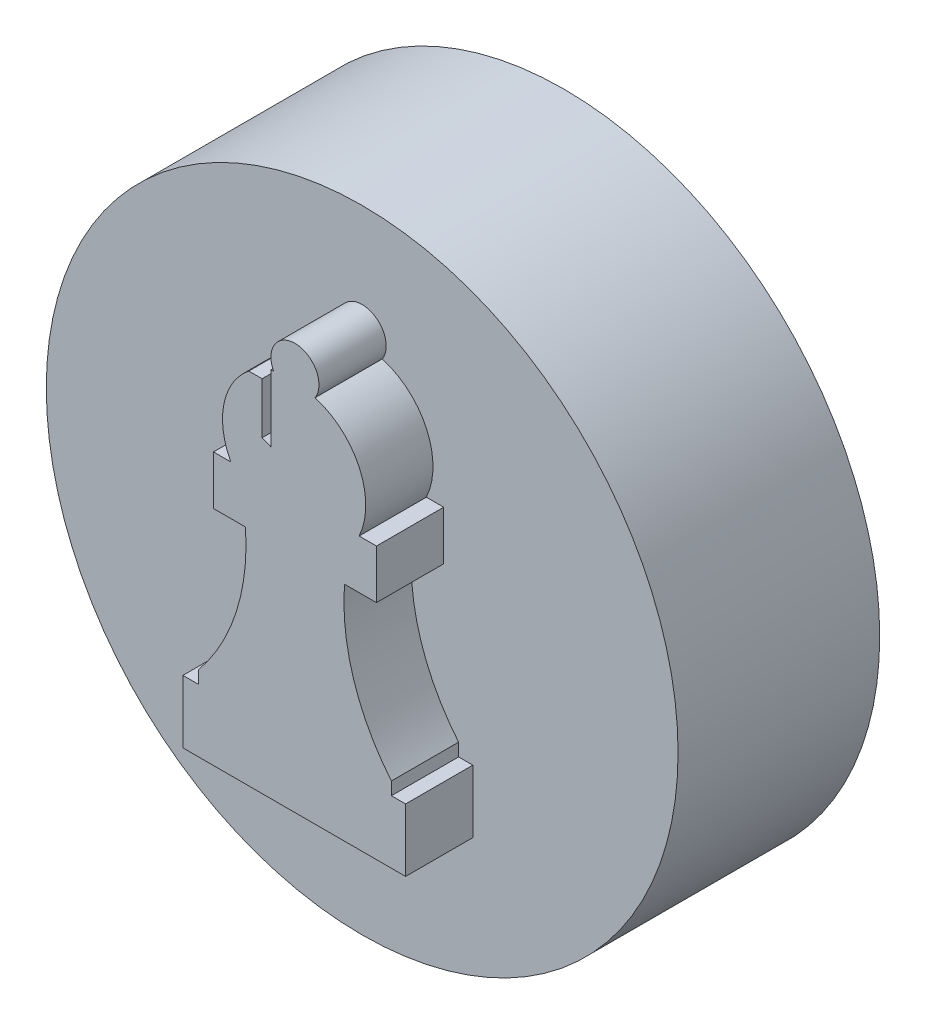
ISO-10303-21;
HEADER;
FILE_DESCRIPTION(('STEP AP214'),'2;1');
FILE_NAME('part.step','',(''),(''),'','','');
FILE_SCHEMA(('AUTOMOTIVE_DESIGN { 1 0 10303 214 1 1 1 1 }'));
ENDSEC;
DATA;
#1=APPLICATION_CONTEXT('core data for automotive mechanical design processes');
#2=APPLICATION_PROTOCOL_DEFINITION('international standard','automotive_design',2000,#1);
#3=PRODUCT_CONTEXT('',#1,'mechanical');
#4=PRODUCT('Part','Part','',(#3));
#5=PRODUCT_RELATED_PRODUCT_CATEGORY('part','',(#4));
#6=PRODUCT_DEFINITION_FORMATION('','',#4);
#7=PRODUCT_DEFINITION_CONTEXT('part definition',#1,'design');
#8=PRODUCT_DEFINITION('design','',#6,#7);
#9=PRODUCT_DEFINITION_SHAPE('','',#8);
#10=(LENGTH_UNIT() NAMED_UNIT(*) SI_UNIT(.MILLI.,.METRE.));
#11=(NAMED_UNIT(*) PLANE_ANGLE_UNIT() SI_UNIT($,.RADIAN.));
#12=(NAMED_UNIT(*) SI_UNIT($,.STERADIAN.) SOLID_ANGLE_UNIT());
#13=UNCERTAINTY_MEASURE_WITH_UNIT(LENGTH_MEASURE(1.E-05),#10,'distance_accuracy_value','');
#14=(GEOMETRIC_REPRESENTATION_CONTEXT(3) GLOBAL_UNCERTAINTY_ASSIGNED_CONTEXT((#13)) GLOBAL_UNIT_ASSIGNED_CONTEXT((#10,
#11,#12)) REPRESENTATION_CONTEXT('',''));
#15=CARTESIAN_POINT('',(0.,0.,0.));
#16=DIRECTION('',(0.,0.,1.));
#17=DIRECTION('',(1.,0.,0.));
#18=AXIS2_PLACEMENT_3D('',#15,#16,#17);
#19=CARTESIAN_POINT('',(0.,0.,0.));
#20=DIRECTION('',(0.,0.,1.));
#21=DIRECTION('',(1.,0.,0.));
#22=AXIS2_PLACEMENT_3D('',#19,#20,#21);
#23=PLANE('',#22);
#24=CARTESIAN_POINT('',(0.,0.,0.));
#25=DIRECTION('',(0.,0.,1.));
#26=DIRECTION('',(1.,0.,0.));
#27=AXIS2_PLACEMENT_3D('',#24,#25,#26);
#28=CIRCLE('',#27,11.938);
#29=CARTESIAN_POINT('',(11.938,0.,0.));
#30=VERTEX_POINT('',#29);
#31=EDGE_CURVE('E11',#30,#30,#28,.T.);
#32=ORIENTED_EDGE('',*,*,#31,.F.);
#33=EDGE_LOOP('',(#32));
#34=FACE_BOUND('',#33,.T.);
#35=CARTESIAN_POINT('',(0.,0.,0.));
#36=DIRECTION('',(0.,0.,1.));
#37=DIRECTION('',(1.,0.,0.));
#38=AXIS2_PLACEMENT_3D('',#35,#36,#37);
#39=CIRCLE('',#38,8.763);
#40=CARTESIAN_POINT('',(8.763,0.,0.));
#41=VERTEX_POINT('',#40);
#42=EDGE_CURVE('E48',#41,#41,#39,.T.);
#43=ORIENTED_EDGE('',*,*,#42,.T.);
#44=EDGE_LOOP('',(#43));
#45=FACE_BOUND('',#44,.T.);
#46=ADVANCED_FACE('F39',(#34,#45),#23,.F.);
#47=CARTESIAN_POINT('',(0.,0.,5.08));
#48=DIRECTION('',(0.,0.,-1.));
#49=DIRECTION('',(-1.,0.,0.));
#50=AXIS2_PLACEMENT_3D('',#47,#48,#49);
#51=CYLINDRICAL_SURFACE('',#50,11.938);
#52=ORIENTED_EDGE('',*,*,#31,.T.);
#53=EDGE_LOOP('',(#52));
#54=FACE_BOUND('',#53,.T.);
#55=CARTESIAN_POINT('',(0.,0.,7.62));
#56=DIRECTION('',(0.,0.,1.));
#57=DIRECTION('',(1.,0.,0.));
#58=AXIS2_PLACEMENT_3D('',#55,#56,#57);
#59=CIRCLE('',#58,11.938);
#60=CARTESIAN_POINT('',(11.938,0.,7.62));
#61=VERTEX_POINT('',#60);
#62=EDGE_CURVE('E219',#61,#61,#59,.T.);
#63=ORIENTED_EDGE('',*,*,#62,.F.);
#64=EDGE_LOOP('',(#63));
#65=FACE_BOUND('',#64,.T.);
#66=ADVANCED_FACE('F41',(#54,#65),#51,.T.);
#67=CARTESIAN_POINT('',(0.,0.,5.08));
#68=DIRECTION('',(0.,0.,-1.));
#69=DIRECTION('',(-1.,0.,0.));
#70=AXIS2_PLACEMENT_3D('',#67,#68,#69);
#71=CYLINDRICAL_SURFACE('',#70,8.763);
#72=CARTESIAN_POINT('',(0.,0.,5.08));
#73=DIRECTION('',(0.,0.,1.));
#74=DIRECTION('',(1.,0.,0.));
#75=AXIS2_PLACEMENT_3D('',#72,#73,#74);
#76=CIRCLE('',#75,8.763);
#77=CARTESIAN_POINT('',(8.763,0.,5.08));
#78=VERTEX_POINT('',#77);
#79=EDGE_CURVE('E224',#78,#78,#76,.T.);
#80=ORIENTED_EDGE('',*,*,#79,.T.);
#81=EDGE_LOOP('',(#80));
#82=FACE_BOUND('',#81,.T.);
#83=ORIENTED_EDGE('',*,*,#42,.F.);
#84=EDGE_LOOP('',(#83));
#85=FACE_BOUND('',#84,.T.);
#86=ADVANCED_FACE('F237',(#82,#85),#71,.F.);
#87=CARTESIAN_POINT('',(0.,0.,5.08));
#88=DIRECTION('',(0.,0.,1.));
#89=DIRECTION('',(1.,0.,0.));
#90=AXIS2_PLACEMENT_3D('',#87,#88,#89);
#91=PLANE('',#90);
#92=ORIENTED_EDGE('',*,*,#79,.F.);
#93=EDGE_LOOP('',(#92));
#94=FACE_BOUND('',#93,.T.);
#95=ADVANCED_FACE('F239',(#94),#91,.F.);
#96=CARTESIAN_POINT('',(0.,0.,7.62));
#97=DIRECTION('',(0.,0.,1.));
#98=DIRECTION('',(1.,0.,0.));
#99=AXIS2_PLACEMENT_3D('',#96,#97,#98);
#100=PLANE('',#99);
#101=CARTESIAN_POINT('',(-0.0936496548773762,4.84947966373049,7.62));
#102=DIRECTION('',(0.,0.,1.));
#103=DIRECTION('',(1.,0.,0.));
#104=AXIS2_PLACEMENT_3D('',#101,#102,#103);
#105=CIRCLE('',#104,2.64442949598873);
#106=CARTESIAN_POINT('',(-1.74431169762998,6.9154714787847,7.62));
#107=VERTEX_POINT('',#106);
#108=CARTESIAN_POINT('',(-2.42520893945643,3.60174625400373,7.62));
#109=VERTEX_POINT('',#108);
#110=EDGE_CURVE('E55',#107,#109,#105,.T.);
#111=ORIENTED_EDGE('',*,*,#110,.F.);
#112=DIRECTION('',(1.,0.,0.));
#113=VECTOR('',#112,1.);
#114=CARTESIAN_POINT('',(-1.74431169762998,6.9154714787847,7.62));
#115=LINE('',#114,#113);
#116=CARTESIAN_POINT('',(-1.24222402192209,6.9154714787847,7.62));
#117=VERTEX_POINT('',#116);
#118=EDGE_CURVE('E60',#107,#117,#115,.T.);
#119=ORIENTED_EDGE('',*,*,#118,.T.);
#120=DIRECTION('',(0.,-1.,0.));
#121=VECTOR('',#120,1.);
#122=CARTESIAN_POINT('',(-1.24222402192209,6.9154714787847,7.62));
#123=LINE('',#122,#121);
#124=CARTESIAN_POINT('',(-1.24222402192209,4.98580544243909,7.62));
#125=VERTEX_POINT('',#124);
#126=EDGE_CURVE('E527',#117,#125,#123,.T.);
#127=ORIENTED_EDGE('',*,*,#126,.T.);
#128=DIRECTION('',(0.926439935150013,-0.376442620540289,0.));
#129=VECTOR('',#128,1.);
#130=CARTESIAN_POINT('',(-1.24222402192209,4.98580544243909,7.62));
#131=LINE('',#130,#129);
#132=CARTESIAN_POINT('',(-0.906720976584663,4.84947966373049,7.62));
#133=VERTEX_POINT('',#132);
#134=EDGE_CURVE('E530',#125,#133,#131,.T.);
#135=ORIENTED_EDGE('',*,*,#134,.T.);
#136=DIRECTION('',(0.,1.,0.));
#137=VECTOR('',#136,1.);
#138=CARTESIAN_POINT('',(-0.906720976584663,4.84947966373049,7.62));
#139=LINE('',#138,#137);
#140=CARTESIAN_POINT('',(-0.906720976584663,7.37263085876686,7.62));
#141=VERTEX_POINT('',#140);
#142=EDGE_CURVE('E679',#133,#141,#139,.T.);
#143=ORIENTED_EDGE('',*,*,#142,.T.);
#144=DIRECTION('',(1.,0.,0.));
#145=VECTOR('',#144,1.);
#146=CARTESIAN_POINT('',(-0.906720976584663,7.37263085876686,7.62));
#147=LINE('',#146,#145);
#148=CARTESIAN_POINT('',(-0.805595187549615,7.37263085876686,7.62));
#149=VERTEX_POINT('',#148);
#150=EDGE_CURVE('E676',#141,#149,#147,.T.);
#151=ORIENTED_EDGE('',*,*,#150,.T.);
#152=CARTESIAN_POINT('',(0.,7.78875502674505,7.62));
#153=DIRECTION('',(0.,0.,1.));
#154=DIRECTION('',(1.,0.,0.));
#155=AXIS2_PLACEMENT_3D('',#152,#153,#154);
#156=CIRCLE('',#155,0.906720976584663);
#157=CARTESIAN_POINT('',(0.760232512341825,7.29459973075291,7.62));
#158=VERTEX_POINT('',#157);
#159=EDGE_CURVE('E672',#158,#149,#156,.T.);
#160=ORIENTED_EDGE('',*,*,#159,.F.);
#161=CARTESIAN_POINT('',(0.00107302512031239,4.73055559467947,7.62));
#162=DIRECTION('',(0.,0.,-1.));
#163=DIRECTION('',(-1.,0.,0.));
#164=AXIS2_PLACEMENT_3D('',#161,#162,#163);
#165=CIRCLE('',#164,2.67406908264746);
#166=CARTESIAN_POINT('',(2.42520893945643,3.60174625400373,7.62));
#167=VERTEX_POINT('',#166);
#168=EDGE_CURVE('E669',#158,#167,#165,.T.);
#169=ORIENTED_EDGE('',*,*,#168,.T.);
#170=DIRECTION('',(1.,0.,0.));
#171=VECTOR('',#170,1.);
#172=CARTESIAN_POINT('',(2.42520893945643,3.60174625400373,7.62));
#173=LINE('',#172,#171);
#174=CARTESIAN_POINT('',(3.07963487745926,3.60174625400373,7.62));
#175=VERTEX_POINT('',#174);
#176=EDGE_CURVE('E666',#167,#175,#173,.T.);
#177=ORIENTED_EDGE('',*,*,#176,.T.);
#178=DIRECTION('',(0.,-1.,0.));
#179=VECTOR('',#178,1.);
#180=CARTESIAN_POINT('',(3.07963487745926,3.60174625400373,7.62));
#181=LINE('',#180,#179);
#182=CARTESIAN_POINT('',(3.07963487745926,1.74914689622965,7.62));
#183=VERTEX_POINT('',#182);
#184=EDGE_CURVE('E663',#175,#183,#181,.T.);
#185=ORIENTED_EDGE('',*,*,#184,.T.);
#186=DIRECTION('',(-1.,0.,0.));
#187=VECTOR('',#186,1.);
#188=CARTESIAN_POINT('',(3.07963487745926,1.74914689622965,7.62));
#189=LINE('',#188,#187);
#190=CARTESIAN_POINT('',(1.87141053803479,1.74914689622965,7.62));
#191=VERTEX_POINT('',#190);
#192=EDGE_CURVE('E660',#183,#191,#189,.T.);
#193=ORIENTED_EDGE('',*,*,#192,.T.);
#194=CARTESIAN_POINT('',(9.63017955509423,1.16502725049051,7.62));
#195=DIRECTION('',(0.,0.,-1.));
#196=DIRECTION('',(-1.,0.,0.));
#197=AXIS2_PLACEMENT_3D('',#194,#195,#196);
#198=CIRCLE('',#197,7.7807257001272);
#199=CARTESIAN_POINT('',(3.64389495603139,-3.8052935761406,7.62));
#200=VERTEX_POINT('',#199);
#201=EDGE_CURVE('E656',#200,#191,#198,.T.);
#202=ORIENTED_EDGE('',*,*,#201,.F.);
#203=DIRECTION('',(0.,1.,0.));
#204=VECTOR('',#203,1.);
#205=CARTESIAN_POINT('',(3.64389495603139,-4.28867332886855,7.62));
#206=LINE('',#205,#204);
#207=CARTESIAN_POINT('',(3.64389495603139,-4.28867332886855,7.62));
#208=VERTEX_POINT('',#207);
#209=EDGE_CURVE('E652',#208,#200,#206,.T.);
#210=ORIENTED_EDGE('',*,*,#209,.F.);
#211=DIRECTION('',(-1.,0.,0.));
#212=VECTOR('',#211,1.);
#213=CARTESIAN_POINT('',(4.18073345920061,-4.28867332886855,7.62));
#214=LINE('',#213,#212);
#215=CARTESIAN_POINT('',(4.18073345920061,-4.28867332886855,7.62));
#216=VERTEX_POINT('',#215);
#217=EDGE_CURVE('E648',#216,#208,#214,.T.);
#218=ORIENTED_EDGE('',*,*,#217,.F.);
#219=DIRECTION('',(0.,-1.,0.));
#220=VECTOR('',#219,1.);
#221=CARTESIAN_POINT('',(4.18073345920061,-4.28867332886855,7.62));
#222=LINE('',#221,#220);
#223=CARTESIAN_POINT('',(4.18073345920061,-6.66173626167252,7.62));
#224=VERTEX_POINT('',#223);
#225=EDGE_CURVE('E645',#216,#224,#222,.T.);
#226=ORIENTED_EDGE('',*,*,#225,.T.);
#227=DIRECTION('',(-1.,0.,0.));
#228=VECTOR('',#227,1.);
#229=CARTESIAN_POINT('',(4.18073345920061,-6.66173626167252,7.62));
#230=LINE('',#229,#228);
#231=CARTESIAN_POINT('',(-4.23507735404233,-6.66173626167252,7.62));
#232=VERTEX_POINT('',#231);
#233=EDGE_CURVE('E642',#224,#232,#230,.T.);
#234=ORIENTED_EDGE('',*,*,#233,.T.);
#235=DIRECTION('',(0.,-1.,0.));
#236=VECTOR('',#235,1.);
#237=CARTESIAN_POINT('',(-4.23507735404233,-4.28867332886855,7.62));
#238=LINE('',#237,#236);
#239=CARTESIAN_POINT('',(-4.23507735404233,-4.28867332886855,7.62));
#240=VERTEX_POINT('',#239);
#241=EDGE_CURVE('E638',#240,#232,#238,.T.);
#242=ORIENTED_EDGE('',*,*,#241,.F.);
#243=DIRECTION('',(-1.,0.,0.));
#244=VECTOR('',#243,1.);
#245=CARTESIAN_POINT('',(-3.64389495603139,-4.28867332886855,7.62));
#246=LINE('',#245,#244);
#247=CARTESIAN_POINT('',(-3.64389495603139,-4.28867332886855,7.62));
#248=VERTEX_POINT('',#247);
#249=EDGE_CURVE('E634',#248,#240,#246,.T.);
#250=ORIENTED_EDGE('',*,*,#249,.F.);
#251=DIRECTION('',(0.,1.,0.));
#252=VECTOR('',#251,1.);
#253=CARTESIAN_POINT('',(-3.64389495603139,-4.28867332886855,7.62));
#254=LINE('',#253,#252);
#255=CARTESIAN_POINT('',(-3.64389495603139,-3.8052935761406,7.62));
#256=VERTEX_POINT('',#255);
#257=EDGE_CURVE('E631',#248,#256,#254,.T.);
#258=ORIENTED_EDGE('',*,*,#257,.T.);
#259=CARTESIAN_POINT('',(-9.63017955509423,1.16502725049051,7.62));
#260=DIRECTION('',(0.,0.,1.));
#261=DIRECTION('',(1.,0.,0.));
#262=AXIS2_PLACEMENT_3D('',#259,#260,#261);
#263=CIRCLE('',#262,7.7807257001272);
#264=CARTESIAN_POINT('',(-1.87141053803479,1.74914689622964,7.62));
#265=VERTEX_POINT('',#264);
#266=EDGE_CURVE('E624',#256,#265,#263,.T.);
#267=ORIENTED_EDGE('',*,*,#266,.T.);
#268=DIRECTION('',(1.,0.,0.));
#269=VECTOR('',#268,1.);
#270=CARTESIAN_POINT('',(-3.07963487745926,1.74914689622965,7.62));
#271=LINE('',#270,#269);
#272=CARTESIAN_POINT('',(-3.07963487745926,1.74914689622965,7.62));
#273=VERTEX_POINT('',#272);
#274=EDGE_CURVE('E615',#273,#265,#271,.T.);
#275=ORIENTED_EDGE('',*,*,#274,.F.);
#276=DIRECTION('',(0.,-1.,0.));
#277=VECTOR('',#276,1.);
#278=CARTESIAN_POINT('',(-3.07963487745926,3.60174625400373,7.62));
#279=LINE('',#278,#277);
#280=CARTESIAN_POINT('',(-3.07963487745926,3.60174625400373,7.62));
#281=VERTEX_POINT('',#280);
#282=EDGE_CURVE('E618',#281,#273,#279,.T.);
#283=ORIENTED_EDGE('',*,*,#282,.F.);
#284=DIRECTION('',(-1.,0.,0.));
#285=VECTOR('',#284,1.);
#286=CARTESIAN_POINT('',(-2.42520893945643,3.60174625400373,7.62));
#287=LINE('',#286,#285);
#288=EDGE_CURVE('E620',#109,#281,#287,.T.);
#289=ORIENTED_EDGE('',*,*,#288,.F.);
#290=EDGE_LOOP('',(#111,#119,#127,#135,#143,#151,#160,#169,#177,#185,#193,#202,#210,#218,#226,
#234,#242,#250,#258,#267,#275,#283,#289));
#291=FACE_BOUND('',#290,.T.);
#292=ORIENTED_EDGE('',*,*,#62,.T.);
#293=EDGE_LOOP('',(#292));
#294=FACE_BOUND('',#293,.T.);
#295=ADVANCED_FACE('F246',(#291,#294),#100,.T.);
#296=CARTESIAN_POINT('',(-0.0936496548773762,4.84947966373049,10.16));
#297=DIRECTION('',(0.,0.,-1.));
#298=DIRECTION('',(-1.,0.,0.));
#299=AXIS2_PLACEMENT_3D('',#296,#297,#298);
#300=CYLINDRICAL_SURFACE('',#299,2.64442949598873);
#301=ORIENTED_EDGE('',*,*,#110,.T.);
#302=DIRECTION('',(0.,0.,-1.));
#303=VECTOR('',#302,1.);
#304=CARTESIAN_POINT('',(-2.42520893945643,3.60174625400373,10.16));
#305=LINE('',#304,#303);
#306=CARTESIAN_POINT('',(-2.42520893945643,3.60174625400373,10.16));
#307=VERTEX_POINT('',#306);
#308=EDGE_CURVE('E199',#307,#109,#305,.T.);
#309=ORIENTED_EDGE('',*,*,#308,.F.);
#310=CARTESIAN_POINT('',(-0.0936496548773762,4.84947966373049,10.16));
#311=DIRECTION('',(0.,0.,1.));
#312=DIRECTION('',(1.,0.,0.));
#313=AXIS2_PLACEMENT_3D('',#310,#311,#312);
#314=CIRCLE('',#313,2.64442949598873);
#315=CARTESIAN_POINT('',(-1.74431169762998,6.9154714787847,10.16));
#316=VERTEX_POINT('',#315);
#317=EDGE_CURVE('E206',#316,#307,#314,.T.);
#318=ORIENTED_EDGE('',*,*,#317,.F.);
#319=DIRECTION('',(0.,0.,-1.));
#320=VECTOR('',#319,1.);
#321=CARTESIAN_POINT('',(-1.74431169762998,6.9154714787847,10.16));
#322=LINE('',#321,#320);
#323=EDGE_CURVE('E523',#316,#107,#322,.T.);
#324=ORIENTED_EDGE('',*,*,#323,.T.);
#325=EDGE_LOOP('',(#301,#309,#318,#324));
#326=FACE_BOUND('',#325,.T.);
#327=ADVANCED_FACE('F217',(#326),#300,.T.);
#328=CARTESIAN_POINT('',(-2.42520893945643,3.60174625400373,10.16));
#329=DIRECTION('',(0.,-1.,0.));
#330=DIRECTION('',(0.,0.,-1.));
#331=AXIS2_PLACEMENT_3D('',#328,#329,#330);
#332=PLANE('',#331);
#333=ORIENTED_EDGE('',*,*,#288,.T.);
#334=DIRECTION('',(0.,0.,-1.));
#335=VECTOR('',#334,1.);
#336=CARTESIAN_POINT('',(-3.07963487745926,3.60174625400373,10.16));
#337=LINE('',#336,#335);
#338=CARTESIAN_POINT('',(-3.07963487745926,3.60174625400373,10.16));
#339=VERTEX_POINT('',#338);
#340=EDGE_CURVE('E201',#339,#281,#337,.T.);
#341=ORIENTED_EDGE('',*,*,#340,.F.);
#342=DIRECTION('',(-1.,0.,0.));
#343=VECTOR('',#342,1.);
#344=CARTESIAN_POINT('',(-2.42520893945643,3.60174625400373,10.16));
#345=LINE('',#344,#343);
#346=EDGE_CURVE('E194',#307,#339,#345,.T.);
#347=ORIENTED_EDGE('',*,*,#346,.F.);
#348=ORIENTED_EDGE('',*,*,#308,.T.);
#349=EDGE_LOOP('',(#333,#341,#347,#348));
#350=FACE_BOUND('',#349,.T.);
#351=ADVANCED_FACE('F197',(#350),#332,.F.);
#352=CARTESIAN_POINT('',(-3.07963487745926,3.60174625400373,10.16));
#353=DIRECTION('',(1.,0.,0.));
#354=DIRECTION('',(0.,0.,-1.));
#355=AXIS2_PLACEMENT_3D('',#352,#353,#354);
#356=PLANE('',#355);
#357=ORIENTED_EDGE('',*,*,#282,.T.);
#358=DIRECTION('',(0.,0.,-1.));
#359=VECTOR('',#358,1.);
#360=CARTESIAN_POINT('',(-3.07963487745926,1.74914689622965,10.16));
#361=LINE('',#360,#359);
#362=CARTESIAN_POINT('',(-3.07963487745926,1.74914689622965,10.16));
#363=VERTEX_POINT('',#362);
#364=EDGE_CURVE('E226',#363,#273,#361,.T.);
#365=ORIENTED_EDGE('',*,*,#364,.F.);
#366=DIRECTION('',(0.,-1.,0.));
#367=VECTOR('',#366,1.);
#368=CARTESIAN_POINT('',(-3.07963487745926,3.60174625400373,10.16));
#369=LINE('',#368,#367);
#370=EDGE_CURVE('E205',#339,#363,#369,.T.);
#371=ORIENTED_EDGE('',*,*,#370,.F.);
#372=ORIENTED_EDGE('',*,*,#340,.T.);
#373=EDGE_LOOP('',(#357,#365,#371,#372));
#374=FACE_BOUND('',#373,.T.);
#375=ADVANCED_FACE('F267',(#374),#356,.F.);
#376=CARTESIAN_POINT('',(-3.07963487745926,1.74914689622965,10.16));
#377=DIRECTION('',(0.,1.,0.));
#378=DIRECTION('',(0.,0.,1.));
#379=AXIS2_PLACEMENT_3D('',#376,#377,#378);
#380=PLANE('',#379);
#381=ORIENTED_EDGE('',*,*,#274,.T.);
#382=DIRECTION('',(0.,0.,-1.));
#383=VECTOR('',#382,1.);
#384=CARTESIAN_POINT('',(-1.87141053803479,1.74914689622964,10.16));
#385=LINE('',#384,#383);
#386=CARTESIAN_POINT('',(-1.87141053803479,1.74914689622964,10.16));
#387=VERTEX_POINT('',#386);
#388=EDGE_CURVE('E606',#387,#265,#385,.T.);
#389=ORIENTED_EDGE('',*,*,#388,.F.);
#390=DIRECTION('',(1.,0.,0.));
#391=VECTOR('',#390,1.);
#392=CARTESIAN_POINT('',(-3.07963487745926,1.74914689622965,10.16));
#393=LINE('',#392,#391);
#394=EDGE_CURVE('E616',#363,#387,#393,.T.);
#395=ORIENTED_EDGE('',*,*,#394,.F.);
#396=ORIENTED_EDGE('',*,*,#364,.T.);
#397=EDGE_LOOP('',(#381,#389,#395,#396));
#398=FACE_BOUND('',#397,.T.);
#399=ADVANCED_FACE('F270',(#398),#380,.F.);
#400=CARTESIAN_POINT('',(-9.63017955509423,1.16502725049051,10.16));
#401=DIRECTION('',(0.,0.,-1.));
#402=DIRECTION('',(-1.,0.,0.));
#403=AXIS2_PLACEMENT_3D('',#400,#401,#402);
#404=CYLINDRICAL_SURFACE('',#403,7.7807257001272);
#405=ORIENTED_EDGE('',*,*,#266,.F.);
#406=DIRECTION('',(0.,0.,-1.));
#407=VECTOR('',#406,1.);
#408=CARTESIAN_POINT('',(-3.64389495603139,-3.8052935761406,10.16));
#409=LINE('',#408,#407);
#410=CARTESIAN_POINT('',(-3.64389495603139,-3.8052935761406,10.16));
#411=VERTEX_POINT('',#410);
#412=EDGE_CURVE('E602',#411,#256,#409,.T.);
#413=ORIENTED_EDGE('',*,*,#412,.F.);
#414=CARTESIAN_POINT('',(-9.63017955509423,1.16502725049051,10.16));
#415=DIRECTION('',(0.,0.,1.));
#416=DIRECTION('',(1.,0.,0.));
#417=AXIS2_PLACEMENT_3D('',#414,#415,#416);
#418=CIRCLE('',#417,7.7807257001272);
#419=EDGE_CURVE('E738',#411,#387,#418,.T.);
#420=ORIENTED_EDGE('',*,*,#419,.T.);
#421=ORIENTED_EDGE('',*,*,#388,.T.);
#422=EDGE_LOOP('',(#405,#413,#420,#421));
#423=FACE_BOUND('',#422,.T.);
#424=ADVANCED_FACE('F274',(#423),#404,.F.);
#425=CARTESIAN_POINT('',(-3.64389495603139,-4.28867332886855,10.16));
#426=DIRECTION('',(-1.,0.,0.));
#427=DIRECTION('',(0.,0.,1.));
#428=AXIS2_PLACEMENT_3D('',#425,#426,#427);
#429=PLANE('',#428);
#430=ORIENTED_EDGE('',*,*,#257,.F.);
#431=DIRECTION('',(0.,0.,-1.));
#432=VECTOR('',#431,1.);
#433=CARTESIAN_POINT('',(-3.64389495603139,-4.28867332886855,10.16));
#434=LINE('',#433,#432);
#435=CARTESIAN_POINT('',(-3.64389495603139,-4.28867332886855,10.16));
#436=VERTEX_POINT('',#435);
#437=EDGE_CURVE('E598',#436,#248,#434,.T.);
#438=ORIENTED_EDGE('',*,*,#437,.F.);
#439=DIRECTION('',(0.,1.,0.));
#440=VECTOR('',#439,1.);
#441=CARTESIAN_POINT('',(-3.64389495603139,-4.28867332886855,10.16));
#442=LINE('',#441,#440);
#443=EDGE_CURVE('E740',#436,#411,#442,.T.);
#444=ORIENTED_EDGE('',*,*,#443,.T.);
#445=ORIENTED_EDGE('',*,*,#412,.T.);
#446=EDGE_LOOP('',(#430,#438,#444,#445));
#447=FACE_BOUND('',#446,.T.);
#448=ADVANCED_FACE('F278',(#447),#429,.T.);
#449=CARTESIAN_POINT('',(-3.64389495603139,-4.28867332886855,10.16));
#450=DIRECTION('',(0.,-1.,0.));
#451=DIRECTION('',(0.,0.,-1.));
#452=AXIS2_PLACEMENT_3D('',#449,#450,#451);
#453=PLANE('',#452);
#454=ORIENTED_EDGE('',*,*,#249,.T.);
#455=DIRECTION('',(0.,0.,-1.));
#456=VECTOR('',#455,1.);
#457=CARTESIAN_POINT('',(-4.23507735404233,-4.28867332886855,10.16));
#458=LINE('',#457,#456);
#459=CARTESIAN_POINT('',(-4.23507735404233,-4.28867332886855,10.16));
#460=VERTEX_POINT('',#459);
#461=EDGE_CURVE('E594',#460,#240,#458,.T.);
#462=ORIENTED_EDGE('',*,*,#461,.F.);
#463=DIRECTION('',(-1.,0.,0.));
#464=VECTOR('',#463,1.);
#465=CARTESIAN_POINT('',(-3.64389495603139,-4.28867332886855,10.16));
#466=LINE('',#465,#464);
#467=EDGE_CURVE('E732',#436,#460,#466,.T.);
#468=ORIENTED_EDGE('',*,*,#467,.F.);
#469=ORIENTED_EDGE('',*,*,#437,.T.);
#470=EDGE_LOOP('',(#454,#462,#468,#469));
#471=FACE_BOUND('',#470,.T.);
#472=ADVANCED_FACE('F282',(#471),#453,.F.);
#473=CARTESIAN_POINT('',(-4.23507735404233,-4.28867332886855,10.16));
#474=DIRECTION('',(1.,0.,0.));
#475=DIRECTION('',(0.,0.,-1.));
#476=AXIS2_PLACEMENT_3D('',#473,#474,#475);
#477=PLANE('',#476);
#478=ORIENTED_EDGE('',*,*,#241,.T.);
#479=DIRECTION('',(0.,0.,-1.));
#480=VECTOR('',#479,1.);
#481=CARTESIAN_POINT('',(-4.23507735404233,-6.66173626167252,10.16));
#482=LINE('',#481,#480);
#483=CARTESIAN_POINT('',(-4.23507735404233,-6.66173626167252,10.16));
#484=VERTEX_POINT('',#483);
#485=EDGE_CURVE('E590',#484,#232,#482,.T.);
#486=ORIENTED_EDGE('',*,*,#485,.F.);
#487=DIRECTION('',(0.,-1.,0.));
#488=VECTOR('',#487,1.);
#489=CARTESIAN_POINT('',(-4.23507735404233,-4.28867332886855,10.16));
#490=LINE('',#489,#488);
#491=EDGE_CURVE('E750',#460,#484,#490,.T.);
#492=ORIENTED_EDGE('',*,*,#491,.F.);
#493=ORIENTED_EDGE('',*,*,#461,.T.);
#494=EDGE_LOOP('',(#478,#486,#492,#493));
#495=FACE_BOUND('',#494,.T.);
#496=ADVANCED_FACE('F286',(#495),#477,.F.);
#497=CARTESIAN_POINT('',(4.18073345920061,-6.66173626167252,10.16));
#498=DIRECTION('',(0.,-1.,0.));
#499=DIRECTION('',(0.,0.,-1.));
#500=AXIS2_PLACEMENT_3D('',#497,#498,#499);
#501=PLANE('',#500);
#502=ORIENTED_EDGE('',*,*,#233,.F.);
#503=DIRECTION('',(0.,0.,-1.));
#504=VECTOR('',#503,1.);
#505=CARTESIAN_POINT('',(4.18073345920061,-6.66173626167252,10.16));
#506=LINE('',#505,#504);
#507=CARTESIAN_POINT('',(4.18073345920061,-6.66173626167252,10.16));
#508=VERTEX_POINT('',#507);
#509=EDGE_CURVE('E586',#508,#224,#506,.T.);
#510=ORIENTED_EDGE('',*,*,#509,.F.);
#511=DIRECTION('',(-1.,0.,0.));
#512=VECTOR('',#511,1.);
#513=CARTESIAN_POINT('',(4.18073345920061,-6.66173626167252,10.16));
#514=LINE('',#513,#512);
#515=EDGE_CURVE('E727',#508,#484,#514,.T.);
#516=ORIENTED_EDGE('',*,*,#515,.T.);
#517=ORIENTED_EDGE('',*,*,#485,.T.);
#518=EDGE_LOOP('',(#502,#510,#516,#517));
#519=FACE_BOUND('',#518,.T.);
#520=ADVANCED_FACE('F290',(#519),#501,.T.);
#521=CARTESIAN_POINT('',(4.18073345920061,-4.28867332886855,10.16));
#522=DIRECTION('',(1.,0.,0.));
#523=DIRECTION('',(0.,0.,-1.));
#524=AXIS2_PLACEMENT_3D('',#521,#522,#523);
#525=PLANE('',#524);
#526=ORIENTED_EDGE('',*,*,#225,.F.);
#527=DIRECTION('',(0.,0.,-1.));
#528=VECTOR('',#527,1.);
#529=CARTESIAN_POINT('',(4.18073345920061,-4.28867332886855,10.16));
#530=LINE('',#529,#528);
#531=CARTESIAN_POINT('',(4.18073345920061,-4.28867332886855,10.16));
#532=VERTEX_POINT('',#531);
#533=EDGE_CURVE('E582',#532,#216,#530,.T.);
#534=ORIENTED_EDGE('',*,*,#533,.F.);
#535=DIRECTION('',(0.,-1.,0.));
#536=VECTOR('',#535,1.);
#537=CARTESIAN_POINT('',(4.18073345920061,-4.28867332886855,10.16));
#538=LINE('',#537,#536);
#539=EDGE_CURVE('E723',#532,#508,#538,.T.);
#540=ORIENTED_EDGE('',*,*,#539,.T.);
#541=ORIENTED_EDGE('',*,*,#509,.T.);
#542=EDGE_LOOP('',(#526,#534,#540,#541));
#543=FACE_BOUND('',#542,.T.);
#544=ADVANCED_FACE('F294',(#543),#525,.T.);
#545=CARTESIAN_POINT('',(4.18073345920061,-4.28867332886855,10.16));
#546=DIRECTION('',(0.,-1.,0.));
#547=DIRECTION('',(0.,0.,-1.));
#548=AXIS2_PLACEMENT_3D('',#545,#546,#547);
#549=PLANE('',#548);
#550=ORIENTED_EDGE('',*,*,#217,.T.);
#551=DIRECTION('',(0.,0.,-1.));
#552=VECTOR('',#551,1.);
#553=CARTESIAN_POINT('',(3.64389495603139,-4.28867332886855,10.16));
#554=LINE('',#553,#552);
#555=CARTESIAN_POINT('',(3.64389495603139,-4.28867332886855,10.16));
#556=VERTEX_POINT('',#555);
#557=EDGE_CURVE('E578',#556,#208,#554,.T.);
#558=ORIENTED_EDGE('',*,*,#557,.F.);
#559=DIRECTION('',(-1.,0.,0.));
#560=VECTOR('',#559,1.);
#561=CARTESIAN_POINT('',(4.18073345920061,-4.28867332886855,10.16));
#562=LINE('',#561,#560);
#563=EDGE_CURVE('E718',#532,#556,#562,.T.);
#564=ORIENTED_EDGE('',*,*,#563,.F.);
#565=ORIENTED_EDGE('',*,*,#533,.T.);
#566=EDGE_LOOP('',(#550,#558,#564,#565));
#567=FACE_BOUND('',#566,.T.);
#568=ADVANCED_FACE('F298',(#567),#549,.F.);
#569=CARTESIAN_POINT('',(3.64389495603139,-4.28867332886855,10.16));
#570=DIRECTION('',(-1.,0.,0.));
#571=DIRECTION('',(0.,0.,1.));
#572=AXIS2_PLACEMENT_3D('',#569,#570,#571);
#573=PLANE('',#572);
#574=ORIENTED_EDGE('',*,*,#209,.T.);
#575=DIRECTION('',(0.,0.,-1.));
#576=VECTOR('',#575,1.);
#577=CARTESIAN_POINT('',(3.64389495603139,-3.8052935761406,10.16));
#578=LINE('',#577,#576);
#579=CARTESIAN_POINT('',(3.64389495603139,-3.8052935761406,10.16));
#580=VERTEX_POINT('',#579);
#581=EDGE_CURVE('E574',#580,#200,#578,.T.);
#582=ORIENTED_EDGE('',*,*,#581,.F.);
#583=DIRECTION('',(0.,1.,0.));
#584=VECTOR('',#583,1.);
#585=CARTESIAN_POINT('',(3.64389495603139,-4.28867332886855,10.16));
#586=LINE('',#585,#584);
#587=EDGE_CURVE('E716',#556,#580,#586,.T.);
#588=ORIENTED_EDGE('',*,*,#587,.F.);
#589=ORIENTED_EDGE('',*,*,#557,.T.);
#590=EDGE_LOOP('',(#574,#582,#588,#589));
#591=FACE_BOUND('',#590,.T.);
#592=ADVANCED_FACE('F302',(#591),#573,.F.);
#593=CARTESIAN_POINT('',(9.63017955509423,1.16502725049051,10.16));
#594=DIRECTION('',(0.,0.,-1.));
#595=DIRECTION('',(-1.,0.,0.));
#596=AXIS2_PLACEMENT_3D('',#593,#594,#595);
#597=CYLINDRICAL_SURFACE('',#596,7.7807257001272);
#598=ORIENTED_EDGE('',*,*,#201,.T.);
#599=DIRECTION('',(0.,0.,-1.));
#600=VECTOR('',#599,1.);
#601=CARTESIAN_POINT('',(1.87141053803479,1.74914689622965,10.16));
#602=LINE('',#601,#600);
#603=CARTESIAN_POINT('',(1.87141053803479,1.74914689622965,10.16));
#604=VERTEX_POINT('',#603);
#605=EDGE_CURVE('E570',#604,#191,#602,.T.);
#606=ORIENTED_EDGE('',*,*,#605,.F.);
#607=CARTESIAN_POINT('',(9.63017955509423,1.16502725049051,10.16));
#608=DIRECTION('',(0.,0.,-1.));
#609=DIRECTION('',(-1.,0.,0.));
#610=AXIS2_PLACEMENT_3D('',#607,#608,#609);
#611=CIRCLE('',#610,7.7807257001272);
#612=EDGE_CURVE('E761',#580,#604,#611,.T.);
#613=ORIENTED_EDGE('',*,*,#612,.F.);
#614=ORIENTED_EDGE('',*,*,#581,.T.);
#615=EDGE_LOOP('',(#598,#606,#613,#614));
#616=FACE_BOUND('',#615,.T.);
#617=ADVANCED_FACE('F306',(#616),#597,.F.);
#618=CARTESIAN_POINT('',(3.07963487745926,1.74914689622965,10.16));
#619=DIRECTION('',(0.,-1.,0.));
#620=DIRECTION('',(0.,0.,-1.));
#621=AXIS2_PLACEMENT_3D('',#618,#619,#620);
#622=PLANE('',#621);
#623=ORIENTED_EDGE('',*,*,#192,.F.);
#624=DIRECTION('',(0.,0.,-1.));
#625=VECTOR('',#624,1.);
#626=CARTESIAN_POINT('',(3.07963487745926,1.74914689622965,10.16));
#627=LINE('',#626,#625);
#628=CARTESIAN_POINT('',(3.07963487745926,1.74914689622965,10.16));
#629=VERTEX_POINT('',#628);
#630=EDGE_CURVE('E566',#629,#183,#627,.T.);
#631=ORIENTED_EDGE('',*,*,#630,.F.);
#632=DIRECTION('',(-1.,0.,0.));
#633=VECTOR('',#632,1.);
#634=CARTESIAN_POINT('',(3.07963487745926,1.74914689622965,10.16));
#635=LINE('',#634,#633);
#636=EDGE_CURVE('E711',#629,#604,#635,.T.);
#637=ORIENTED_EDGE('',*,*,#636,.T.);
#638=ORIENTED_EDGE('',*,*,#605,.T.);
#639=EDGE_LOOP('',(#623,#631,#637,#638));
#640=FACE_BOUND('',#639,.T.);
#641=ADVANCED_FACE('F310',(#640),#622,.T.);
#642=CARTESIAN_POINT('',(3.07963487745926,3.60174625400373,10.16));
#643=DIRECTION('',(1.,0.,0.));
#644=DIRECTION('',(0.,0.,-1.));
#645=AXIS2_PLACEMENT_3D('',#642,#643,#644);
#646=PLANE('',#645);
#647=ORIENTED_EDGE('',*,*,#184,.F.);
#648=DIRECTION('',(0.,0.,-1.));
#649=VECTOR('',#648,1.);
#650=CARTESIAN_POINT('',(3.07963487745926,3.60174625400373,10.16));
#651=LINE('',#650,#649);
#652=CARTESIAN_POINT('',(3.07963487745926,3.60174625400373,10.16));
#653=VERTEX_POINT('',#652);
#654=EDGE_CURVE('E562',#653,#175,#651,.T.);
#655=ORIENTED_EDGE('',*,*,#654,.F.);
#656=DIRECTION('',(0.,-1.,0.));
#657=VECTOR('',#656,1.);
#658=CARTESIAN_POINT('',(3.07963487745926,3.60174625400373,10.16));
#659=LINE('',#658,#657);
#660=EDGE_CURVE('E707',#653,#629,#659,.T.);
#661=ORIENTED_EDGE('',*,*,#660,.T.);
#662=ORIENTED_EDGE('',*,*,#630,.T.);
#663=EDGE_LOOP('',(#647,#655,#661,#662));
#664=FACE_BOUND('',#663,.T.);
#665=ADVANCED_FACE('F314',(#664),#646,.T.);
#666=CARTESIAN_POINT('',(2.42520893945643,3.60174625400373,10.16));
#667=DIRECTION('',(0.,1.,0.));
#668=DIRECTION('',(0.,0.,1.));
#669=AXIS2_PLACEMENT_3D('',#666,#667,#668);
#670=PLANE('',#669);
#671=ORIENTED_EDGE('',*,*,#176,.F.);
#672=DIRECTION('',(0.,0.,-1.));
#673=VECTOR('',#672,1.);
#674=CARTESIAN_POINT('',(2.42520893945643,3.60174625400373,10.16));
#675=LINE('',#674,#673);
#676=CARTESIAN_POINT('',(2.42520893945643,3.60174625400373,10.16));
#677=VERTEX_POINT('',#676);
#678=EDGE_CURVE('E558',#677,#167,#675,.T.);
#679=ORIENTED_EDGE('',*,*,#678,.F.);
#680=DIRECTION('',(1.,0.,0.));
#681=VECTOR('',#680,1.);
#682=CARTESIAN_POINT('',(2.42520893945643,3.60174625400373,10.16));
#683=LINE('',#682,#681);
#684=EDGE_CURVE('E768',#677,#653,#683,.T.);
#685=ORIENTED_EDGE('',*,*,#684,.T.);
#686=ORIENTED_EDGE('',*,*,#654,.T.);
#687=EDGE_LOOP('',(#671,#679,#685,#686));
#688=FACE_BOUND('',#687,.T.);
#689=ADVANCED_FACE('F318',(#688),#670,.T.);
#690=CARTESIAN_POINT('',(0.00107302512031239,4.73055559467947,10.16));
#691=DIRECTION('',(0.,0.,-1.));
#692=DIRECTION('',(-1.,0.,0.));
#693=AXIS2_PLACEMENT_3D('',#690,#691,#692);
#694=CYLINDRICAL_SURFACE('',#693,2.67406908264746);
#695=ORIENTED_EDGE('',*,*,#168,.F.);
#696=DIRECTION('',(0.,0.,-1.));
#697=VECTOR('',#696,1.);
#698=CARTESIAN_POINT('',(0.760232512341825,7.29459973075291,10.16));
#699=LINE('',#698,#697);
#700=CARTESIAN_POINT('',(0.760232512341825,7.29459973075291,10.16));
#701=VERTEX_POINT('',#700);
#702=EDGE_CURVE('E554',#701,#158,#699,.T.);
#703=ORIENTED_EDGE('',*,*,#702,.F.);
#704=CARTESIAN_POINT('',(0.00107302512031239,4.73055559467947,10.16));
#705=DIRECTION('',(0.,0.,-1.));
#706=DIRECTION('',(-1.,0.,0.));
#707=AXIS2_PLACEMENT_3D('',#704,#705,#706);
#708=CIRCLE('',#707,2.67406908264746);
#709=EDGE_CURVE('E700',#701,#677,#708,.T.);
#710=ORIENTED_EDGE('',*,*,#709,.T.);
#711=ORIENTED_EDGE('',*,*,#678,.T.);
#712=EDGE_LOOP('',(#695,#703,#710,#711));
#713=FACE_BOUND('',#712,.T.);
#714=ADVANCED_FACE('F322',(#713),#694,.T.);
#715=CARTESIAN_POINT('',(0.,7.78875502674505,10.16));
#716=DIRECTION('',(0.,0.,-1.));
#717=DIRECTION('',(-1.,0.,0.));
#718=AXIS2_PLACEMENT_3D('',#715,#716,#717);
#719=CYLINDRICAL_SURFACE('',#718,0.906720976584663);
#720=ORIENTED_EDGE('',*,*,#159,.T.);
#721=DIRECTION('',(0.,0.,-1.));
#722=VECTOR('',#721,1.);
#723=CARTESIAN_POINT('',(-0.805595187549615,7.37263085876686,10.16));
#724=LINE('',#723,#722);
#725=CARTESIAN_POINT('',(-0.805595187549615,7.37263085876686,10.16));
#726=VERTEX_POINT('',#725);
#727=EDGE_CURVE('E550',#726,#149,#724,.T.);
#728=ORIENTED_EDGE('',*,*,#727,.F.);
#729=CARTESIAN_POINT('',(0.,7.78875502674505,10.16));
#730=DIRECTION('',(0.,0.,1.));
#731=DIRECTION('',(1.,0.,0.));
#732=AXIS2_PLACEMENT_3D('',#729,#730,#731);
#733=CIRCLE('',#732,0.906720976584663);
#734=EDGE_CURVE('E696',#701,#726,#733,.T.);
#735=ORIENTED_EDGE('',*,*,#734,.F.);
#736=ORIENTED_EDGE('',*,*,#702,.T.);
#737=EDGE_LOOP('',(#720,#728,#735,#736));
#738=FACE_BOUND('',#737,.T.);
#739=ADVANCED_FACE('F326',(#738),#719,.T.);
#740=CARTESIAN_POINT('',(-0.906720976584663,7.37263085876686,10.16));
#741=DIRECTION('',(0.,1.,0.));
#742=DIRECTION('',(0.,0.,1.));
#743=AXIS2_PLACEMENT_3D('',#740,#741,#742);
#744=PLANE('',#743);
#745=ORIENTED_EDGE('',*,*,#150,.F.);
#746=DIRECTION('',(0.,0.,-1.));
#747=VECTOR('',#746,1.);
#748=CARTESIAN_POINT('',(-0.906720976584663,7.37263085876686,10.16));
#749=LINE('',#748,#747);
#750=CARTESIAN_POINT('',(-0.906720976584663,7.37263085876686,10.16));
#751=VERTEX_POINT('',#750);
#752=EDGE_CURVE('E546',#751,#141,#749,.T.);
#753=ORIENTED_EDGE('',*,*,#752,.F.);
#754=DIRECTION('',(1.,0.,0.));
#755=VECTOR('',#754,1.);
#756=CARTESIAN_POINT('',(-0.906720976584663,7.37263085876686,10.16));
#757=LINE('',#756,#755);
#758=EDGE_CURVE('E775',#751,#726,#757,.T.);
#759=ORIENTED_EDGE('',*,*,#758,.T.);
#760=ORIENTED_EDGE('',*,*,#727,.T.);
#761=EDGE_LOOP('',(#745,#753,#759,#760));
#762=FACE_BOUND('',#761,.T.);
#763=ADVANCED_FACE('F330',(#762),#744,.T.);
#764=CARTESIAN_POINT('',(-0.906720976584663,4.84947966373049,10.16));
#765=DIRECTION('',(-1.,0.,0.));
#766=DIRECTION('',(0.,0.,1.));
#767=AXIS2_PLACEMENT_3D('',#764,#765,#766);
#768=PLANE('',#767);
#769=ORIENTED_EDGE('',*,*,#142,.F.);
#770=DIRECTION('',(0.,0.,-1.));
#771=VECTOR('',#770,1.);
#772=CARTESIAN_POINT('',(-0.906720976584663,4.84947966373049,10.16));
#773=LINE('',#772,#771);
#774=CARTESIAN_POINT('',(-0.906720976584663,4.84947966373049,10.16));
#775=VERTEX_POINT('',#774);
#776=EDGE_CURVE('E542',#775,#133,#773,.T.);
#777=ORIENTED_EDGE('',*,*,#776,.F.);
#778=DIRECTION('',(0.,1.,0.));
#779=VECTOR('',#778,1.);
#780=CARTESIAN_POINT('',(-0.906720976584663,4.84947966373049,10.16));
#781=LINE('',#780,#779);
#782=EDGE_CURVE('E690',#775,#751,#781,.T.);
#783=ORIENTED_EDGE('',*,*,#782,.T.);
#784=ORIENTED_EDGE('',*,*,#752,.T.);
#785=EDGE_LOOP('',(#769,#777,#783,#784));
#786=FACE_BOUND('',#785,.T.);
#787=ADVANCED_FACE('F334',(#786),#768,.T.);
#788=CARTESIAN_POINT('',(-1.24222402192209,4.98580544243909,10.16));
#789=DIRECTION('',(0.376442620540289,0.926439935150013,0.));
#790=DIRECTION('',(-0.926439935150013,0.376442620540289,0.));
#791=AXIS2_PLACEMENT_3D('',#788,#789,#790);
#792=PLANE('',#791);
#793=ORIENTED_EDGE('',*,*,#134,.F.);
#794=DIRECTION('',(0.,0.,-1.));
#795=VECTOR('',#794,1.);
#796=CARTESIAN_POINT('',(-1.24222402192209,4.98580544243909,10.16));
#797=LINE('',#796,#795);
#798=CARTESIAN_POINT('',(-1.24222402192209,4.98580544243909,10.16));
#799=VERTEX_POINT('',#798);
#800=EDGE_CURVE('E538',#799,#125,#797,.T.);
#801=ORIENTED_EDGE('',*,*,#800,.F.);
#802=DIRECTION('',(0.926439935150013,-0.376442620540289,0.));
#803=VECTOR('',#802,1.);
#804=CARTESIAN_POINT('',(-1.24222402192209,4.98580544243909,10.16));
#805=LINE('',#804,#803);
#806=EDGE_CURVE('E686',#799,#775,#805,.T.);
#807=ORIENTED_EDGE('',*,*,#806,.T.);
#808=ORIENTED_EDGE('',*,*,#776,.T.);
#809=EDGE_LOOP('',(#793,#801,#807,#808));
#810=FACE_BOUND('',#809,.T.);
#811=ADVANCED_FACE('F338',(#810),#792,.T.);
#812=CARTESIAN_POINT('',(-1.24222402192209,6.9154714787847,10.16));
#813=DIRECTION('',(1.,0.,0.));
#814=DIRECTION('',(0.,0.,-1.));
#815=AXIS2_PLACEMENT_3D('',#812,#813,#814);
#816=PLANE('',#815);
#817=ORIENTED_EDGE('',*,*,#126,.F.);
#818=DIRECTION('',(0.,0.,-1.));
#819=VECTOR('',#818,1.);
#820=CARTESIAN_POINT('',(-1.24222402192209,6.9154714787847,10.16));
#821=LINE('',#820,#819);
#822=CARTESIAN_POINT('',(-1.24222402192209,6.9154714787847,10.16));
#823=VERTEX_POINT('',#822);
#824=EDGE_CURVE('E524',#823,#117,#821,.T.);
#825=ORIENTED_EDGE('',*,*,#824,.F.);
#826=DIRECTION('',(0.,-1.,0.));
#827=VECTOR('',#826,1.);
#828=CARTESIAN_POINT('',(-1.24222402192209,6.9154714787847,10.16));
#829=LINE('',#828,#827);
#830=EDGE_CURVE('E782',#823,#799,#829,.T.);
#831=ORIENTED_EDGE('',*,*,#830,.T.);
#832=ORIENTED_EDGE('',*,*,#800,.T.);
#833=EDGE_LOOP('',(#817,#825,#831,#832));
#834=FACE_BOUND('',#833,.T.);
#835=ADVANCED_FACE('F342',(#834),#816,.T.);
#836=CARTESIAN_POINT('',(-1.74431169762998,6.9154714787847,10.16));
#837=DIRECTION('',(0.,1.,0.));
#838=DIRECTION('',(0.,0.,1.));
#839=AXIS2_PLACEMENT_3D('',#836,#837,#838);
#840=PLANE('',#839);
#841=ORIENTED_EDGE('',*,*,#118,.F.);
#842=ORIENTED_EDGE('',*,*,#323,.F.);
#843=DIRECTION('',(1.,0.,0.));
#844=VECTOR('',#843,1.);
#845=CARTESIAN_POINT('',(-1.74431169762998,6.9154714787847,10.16));
#846=LINE('',#845,#844);
#847=EDGE_CURVE('E213',#316,#823,#846,.T.);
#848=ORIENTED_EDGE('',*,*,#847,.T.);
#849=ORIENTED_EDGE('',*,*,#824,.T.);
#850=EDGE_LOOP('',(#841,#842,#848,#849));
#851=FACE_BOUND('',#850,.T.);
#852=ADVANCED_FACE('F346',(#851),#840,.T.);
#853=CARTESIAN_POINT('',(-0.0936496548773762,4.84947966373049,10.16));
#854=DIRECTION('',(0.,0.,1.));
#855=DIRECTION('',(1.,0.,0.));
#856=AXIS2_PLACEMENT_3D('',#853,#854,#855);
#857=PLANE('',#856);
#858=ORIENTED_EDGE('',*,*,#317,.T.);
#859=ORIENTED_EDGE('',*,*,#346,.T.);
#860=ORIENTED_EDGE('',*,*,#370,.T.);
#861=ORIENTED_EDGE('',*,*,#394,.T.);
#862=ORIENTED_EDGE('',*,*,#419,.F.);
#863=ORIENTED_EDGE('',*,*,#443,.F.);
#864=ORIENTED_EDGE('',*,*,#467,.T.);
#865=ORIENTED_EDGE('',*,*,#491,.T.);
#866=ORIENTED_EDGE('',*,*,#515,.F.);
#867=ORIENTED_EDGE('',*,*,#539,.F.);
#868=ORIENTED_EDGE('',*,*,#563,.T.);
#869=ORIENTED_EDGE('',*,*,#587,.T.);
#870=ORIENTED_EDGE('',*,*,#612,.T.);
#871=ORIENTED_EDGE('',*,*,#636,.F.);
#872=ORIENTED_EDGE('',*,*,#660,.F.);
#873=ORIENTED_EDGE('',*,*,#684,.F.);
#874=ORIENTED_EDGE('',*,*,#709,.F.);
#875=ORIENTED_EDGE('',*,*,#734,.T.);
#876=ORIENTED_EDGE('',*,*,#758,.F.);
#877=ORIENTED_EDGE('',*,*,#782,.F.);
#878=ORIENTED_EDGE('',*,*,#806,.F.);
#879=ORIENTED_EDGE('',*,*,#830,.F.);
#880=ORIENTED_EDGE('',*,*,#847,.F.);
#881=EDGE_LOOP('',(#858,#859,#860,#861,#862,#863,#864,#865,#866,#867,#868,#869,#870,#871,#872,
#873,#874,#875,#876,#877,#878,#879,#880));
#882=FACE_BOUND('',#881,.T.);
#883=ADVANCED_FACE('F210',(#882),#857,.T.);
#884=CLOSED_SHELL('',(#46,#66,#86,#95,#295,#327,#351,#375,#399,#424,#448,#472,#496,#520,#544,
#568,#592,#617,#641,#665,#689,#714,#739,#763,#787,#811,#835,#852,#883));
#885=MANIFOLD_SOLID_BREP('B2',#884);
#886=ADVANCED_BREP_SHAPE_REPRESENTATION('',(#18,#885),#14);
#887=SHAPE_DEFINITION_REPRESENTATION(#9,#886);
ENDSEC;
END-ISO-10303-21;
